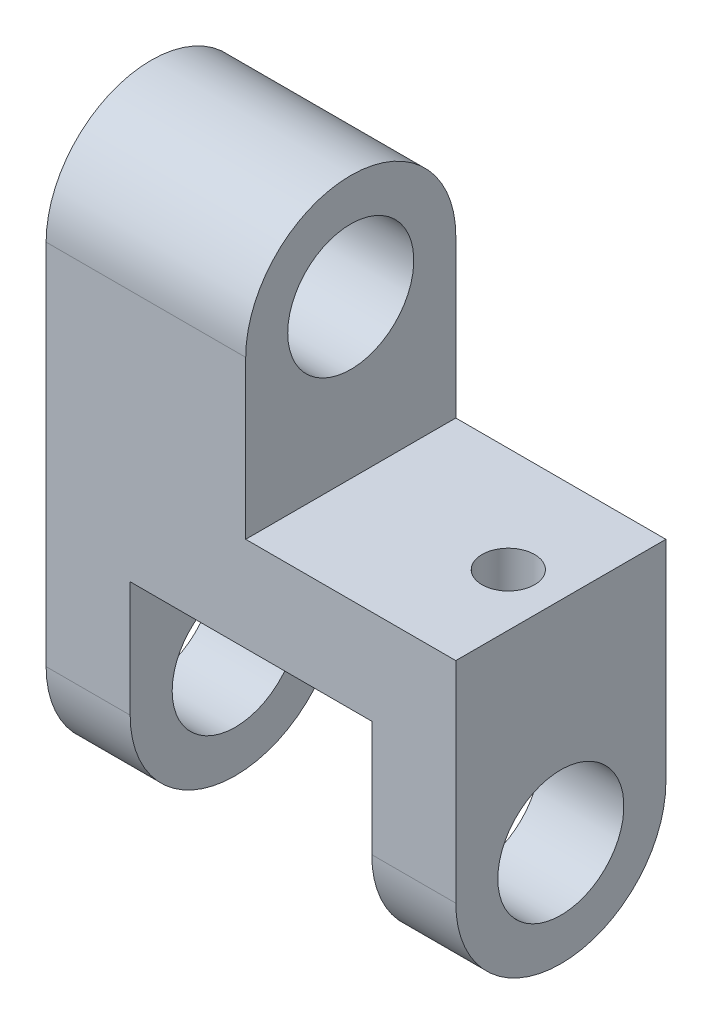
ISO-10303-21;
HEADER;
FILE_DESCRIPTION(('STEP AP214'),'2;1');
FILE_NAME('part.step','',(''),(''),'','','');
FILE_SCHEMA(('AUTOMOTIVE_DESIGN { 1 0 10303 214 1 1 1 1 }'));
ENDSEC;
DATA;
#1=APPLICATION_CONTEXT('core data for automotive mechanical design processes');
#2=APPLICATION_PROTOCOL_DEFINITION('international standard','automotive_design',2000,#1);
#3=PRODUCT_CONTEXT('',#1,'mechanical');
#4=PRODUCT('Part','Part','',(#3));
#5=PRODUCT_RELATED_PRODUCT_CATEGORY('part','',(#4));
#6=PRODUCT_DEFINITION_FORMATION('','',#4);
#7=PRODUCT_DEFINITION_CONTEXT('part definition',#1,'design');
#8=PRODUCT_DEFINITION('design','',#6,#7);
#9=PRODUCT_DEFINITION_SHAPE('','',#8);
#10=(LENGTH_UNIT() NAMED_UNIT(*) SI_UNIT(.MILLI.,.METRE.));
#11=(NAMED_UNIT(*) PLANE_ANGLE_UNIT() SI_UNIT($,.RADIAN.));
#12=(NAMED_UNIT(*) SI_UNIT($,.STERADIAN.) SOLID_ANGLE_UNIT());
#13=UNCERTAINTY_MEASURE_WITH_UNIT(LENGTH_MEASURE(1.E-05),#10,'distance_accuracy_value','');
#14=(GEOMETRIC_REPRESENTATION_CONTEXT(3) GLOBAL_UNCERTAINTY_ASSIGNED_CONTEXT((#13)) GLOBAL_UNIT_ASSIGNED_CONTEXT((#10,
#11,#12)) REPRESENTATION_CONTEXT('',''));
#15=CARTESIAN_POINT('',(0.,0.,0.));
#16=DIRECTION('',(0.,0.,1.));
#17=DIRECTION('',(1.,0.,0.));
#18=AXIS2_PLACEMENT_3D('',#15,#16,#17);
#19=CARTESIAN_POINT('',(39.,-17.5,-1.11022302462516E-13));
#20=DIRECTION('',(-1.,0.,0.));
#21=DIRECTION('',(0.,0.,1.));
#22=AXIS2_PLACEMENT_3D('',#19,#20,#21);
#23=CYLINDRICAL_SURFACE('',#22,10.);
#24=DIRECTION('',(-1.,0.,0.));
#25=VECTOR('',#24,1.);
#26=CARTESIAN_POINT('',(39.,-17.5,-10.0000000000002));
#27=LINE('',#26,#25);
#28=CARTESIAN_POINT('',(8.00000000000001,-17.4999999999999,-10.0000000000002));
#29=VERTEX_POINT('',#28);
#30=CARTESIAN_POINT('',(0.,-17.5,-10.0000000000003));
#31=VERTEX_POINT('',#30);
#32=EDGE_CURVE('E230',#29,#31,#27,.T.);
#33=ORIENTED_EDGE('',*,*,#32,.F.);
#34=CARTESIAN_POINT('',(8.00000000000001,-17.5,-1.38777878078145E-13));
#35=DIRECTION('',(-1.,0.,0.));
#36=DIRECTION('',(0.,-1.,0.));
#37=AXIS2_PLACEMENT_3D('',#34,#35,#36);
#38=CIRCLE('',#37,10.);
#39=CARTESIAN_POINT('',(8.00000000000001,-17.4999999999999,9.99999999999982));
#40=VERTEX_POINT('',#39);
#41=EDGE_CURVE('E186',#29,#40,#38,.T.);
#42=ORIENTED_EDGE('',*,*,#41,.T.);
#43=DIRECTION('',(-1.,0.,0.));
#44=VECTOR('',#43,1.);
#45=CARTESIAN_POINT('',(39.,-17.5,9.99999999999994));
#46=LINE('',#45,#44);
#47=CARTESIAN_POINT('',(0.,-17.5,9.99999999999984));
#48=VERTEX_POINT('',#47);
#49=EDGE_CURVE('E235',#40,#48,#46,.T.);
#50=ORIENTED_EDGE('',*,*,#49,.T.);
#51=CARTESIAN_POINT('',(0.,-17.5,0.));
#52=DIRECTION('',(1.,0.,0.));
#53=DIRECTION('',(0.,0.,-1.));
#54=AXIS2_PLACEMENT_3D('',#51,#52,#53);
#55=CIRCLE('',#54,10.);
#56=EDGE_CURVE('E221',#48,#31,#55,.T.);
#57=ORIENTED_EDGE('',*,*,#56,.T.);
#58=EDGE_LOOP('',(#33,#42,#50,#57));
#59=FACE_BOUND('',#58,.T.);
#60=ADVANCED_FACE('F38',(#59),#23,.T.);
#61=CARTESIAN_POINT('',(39.,-17.5,-1.11022302462516E-13));
#62=DIRECTION('',(-1.,0.,0.));
#63=DIRECTION('',(0.,0.,1.));
#64=AXIS2_PLACEMENT_3D('',#61,#62,#63);
#65=CYLINDRICAL_SURFACE('',#64,6.);
#66=CARTESIAN_POINT('',(8.00000000000001,-17.5,-1.38777878078145E-13));
#67=DIRECTION('',(-1.,0.,0.));
#68=DIRECTION('',(0.,-1.,0.));
#69=AXIS2_PLACEMENT_3D('',#66,#67,#68);
#70=CIRCLE('',#69,6.);
#71=CARTESIAN_POINT('',(8.00000000000001,-23.5,-1.38444811170757E-13));
#72=VERTEX_POINT('',#71);
#73=EDGE_CURVE('E185',#72,#72,#70,.T.);
#74=ORIENTED_EDGE('',*,*,#73,.F.);
#75=EDGE_LOOP('',(#74));
#76=FACE_BOUND('',#75,.T.);
#77=CARTESIAN_POINT('',(0.,-17.5,0.));
#78=DIRECTION('',(1.,0.,0.));
#79=DIRECTION('',(0.,0.,1.));
#80=AXIS2_PLACEMENT_3D('',#77,#78,#79);
#81=CIRCLE('',#80,6.);
#82=CARTESIAN_POINT('',(0.,-17.5,5.99999999999998));
#83=VERTEX_POINT('',#82);
#84=EDGE_CURVE('E190',#83,#83,#81,.T.);
#85=ORIENTED_EDGE('',*,*,#84,.F.);
#86=EDGE_LOOP('',(#85));
#87=FACE_BOUND('',#86,.T.);
#88=ADVANCED_FACE('F249',(#76,#87),#65,.F.);
#89=CARTESIAN_POINT('',(39.,17.5,-1.80411241501588E-13));
#90=DIRECTION('',(1.,0.,0.));
#91=DIRECTION('',(0.,0.,-1.));
#92=AXIS2_PLACEMENT_3D('',#89,#90,#91);
#93=PLANE('',#92);
#94=DIRECTION('',(0.,0.,-1.));
#95=VECTOR('',#94,1.);
#96=CARTESIAN_POINT('',(39.,2.50000000000007,0.));
#97=LINE('',#96,#95);
#98=CARTESIAN_POINT('',(39.,2.49999999999999,9.99999999999976));
#99=VERTEX_POINT('',#98);
#100=CARTESIAN_POINT('',(39.,2.50000000000009,-10.0000000000003));
#101=VERTEX_POINT('',#100);
#102=EDGE_CURVE('E56',#99,#101,#97,.T.);
#103=ORIENTED_EDGE('',*,*,#102,.F.);
#104=DIRECTION('',(0.,-1.,0.));
#105=VECTOR('',#104,1.);
#106=CARTESIAN_POINT('',(39.,17.5,9.99999999999995));
#107=LINE('',#106,#105);
#108=CARTESIAN_POINT('',(39.,-17.5,9.99999999999994));
#109=VERTEX_POINT('',#108);
#110=EDGE_CURVE('E139',#99,#109,#107,.T.);
#111=ORIENTED_EDGE('',*,*,#110,.T.);
#112=CARTESIAN_POINT('',(39.,-17.5,-1.11022302462516E-13));
#113=DIRECTION('',(1.,0.,0.));
#114=DIRECTION('',(0.,0.,-1.));
#115=AXIS2_PLACEMENT_3D('',#112,#113,#114);
#116=CIRCLE('',#115,10.);
#117=CARTESIAN_POINT('',(39.,-17.5,-10.0000000000002));
#118=VERTEX_POINT('',#117);
#119=EDGE_CURVE('E205',#109,#118,#116,.T.);
#120=ORIENTED_EDGE('',*,*,#119,.T.);
#121=DIRECTION('',(0.,1.,0.));
#122=VECTOR('',#121,1.);
#123=CARTESIAN_POINT('',(39.,17.5,-10.0000000000001));
#124=LINE('',#123,#122);
#125=EDGE_CURVE('E209',#118,#101,#124,.T.);
#126=ORIENTED_EDGE('',*,*,#125,.T.);
#127=EDGE_LOOP('',(#103,#111,#120,#126));
#128=FACE_BOUND('',#127,.T.);
#129=CARTESIAN_POINT('',(39.,-17.5,-1.11022302462516E-13));
#130=DIRECTION('',(1.,0.,0.));
#131=DIRECTION('',(0.,0.,1.));
#132=AXIS2_PLACEMENT_3D('',#129,#130,#131);
#133=CIRCLE('',#132,6.);
#134=CARTESIAN_POINT('',(39.,-17.5,5.9999999999999));
#135=VERTEX_POINT('',#134);
#136=EDGE_CURVE('E191',#135,#135,#133,.T.);
#137=ORIENTED_EDGE('',*,*,#136,.F.);
#138=EDGE_LOOP('',(#137));
#139=FACE_BOUND('',#138,.T.);
#140=ADVANCED_FACE('F252',(#128,#139),#93,.T.);
#141=CARTESIAN_POINT('',(0.,17.5,-2.08166817117217E-13));
#142=DIRECTION('',(1.,0.,0.));
#143=DIRECTION('',(0.,0.,-1.));
#144=AXIS2_PLACEMENT_3D('',#141,#142,#143);
#145=PLANE('',#144);
#146=CARTESIAN_POINT('',(0.,17.5,-2.08166817117217E-13));
#147=DIRECTION('',(1.,0.,0.));
#148=DIRECTION('',(0.,0.,-1.));
#149=AXIS2_PLACEMENT_3D('',#146,#147,#148);
#150=CIRCLE('',#149,10.);
#151=CARTESIAN_POINT('',(0.,17.5,-10.));
#152=VERTEX_POINT('',#151);
#153=CARTESIAN_POINT('',(0.,17.5,9.99999999999977));
#154=VERTEX_POINT('',#153);
#155=EDGE_CURVE('E202',#152,#154,#150,.T.);
#156=ORIENTED_EDGE('',*,*,#155,.F.);
#157=DIRECTION('',(0.,1.,0.));
#158=VECTOR('',#157,1.);
#159=CARTESIAN_POINT('',(0.,17.5,-10.));
#160=LINE('',#159,#158);
#161=EDGE_CURVE('E206',#31,#152,#160,.T.);
#162=ORIENTED_EDGE('',*,*,#161,.F.);
#163=ORIENTED_EDGE('',*,*,#56,.F.);
#164=DIRECTION('',(0.,-1.,0.));
#165=VECTOR('',#164,1.);
#166=CARTESIAN_POINT('',(0.,17.5,9.99999999999977));
#167=LINE('',#166,#165);
#168=EDGE_CURVE('E217',#154,#48,#167,.T.);
#169=ORIENTED_EDGE('',*,*,#168,.F.);
#170=EDGE_LOOP('',(#156,#162,#163,#169));
#171=FACE_BOUND('',#170,.T.);
#172=CARTESIAN_POINT('',(0.,17.5,-2.08166817117217E-13));
#173=DIRECTION('',(1.,0.,0.));
#174=DIRECTION('',(0.,0.,-1.));
#175=AXIS2_PLACEMENT_3D('',#172,#173,#174);
#176=CIRCLE('',#175,6.);
#177=CARTESIAN_POINT('',(0.,17.5,-6.00000000000022));
#178=VERTEX_POINT('',#177);
#179=EDGE_CURVE('E195',#178,#178,#176,.T.);
#180=ORIENTED_EDGE('',*,*,#179,.T.);
#181=EDGE_LOOP('',(#180));
#182=FACE_BOUND('',#181,.T.);
#183=ORIENTED_EDGE('',*,*,#84,.T.);
#184=EDGE_LOOP('',(#183));
#185=FACE_BOUND('',#184,.T.);
#186=ADVANCED_FACE('F257',(#171,#182,#185),#145,.F.);
#187=CARTESIAN_POINT('',(39.,17.5,-1.80411241501588E-13));
#188=DIRECTION('',(-1.,0.,0.));
#189=DIRECTION('',(0.,0.,1.));
#190=AXIS2_PLACEMENT_3D('',#187,#188,#189);
#191=CYLINDRICAL_SURFACE('',#190,10.);
#192=DIRECTION('',(-1.,0.,0.));
#193=VECTOR('',#192,1.);
#194=CARTESIAN_POINT('',(39.,17.5,9.99999999999995));
#195=LINE('',#194,#193);
#196=CARTESIAN_POINT('',(19.,17.5000000000001,9.99999999999995));
#197=VERTEX_POINT('',#196);
#198=EDGE_CURVE('E11',#197,#154,#195,.T.);
#199=ORIENTED_EDGE('',*,*,#198,.F.);
#200=CARTESIAN_POINT('',(19.,17.5,-2.22044604925031E-13));
#201=DIRECTION('',(-1.,0.,0.));
#202=DIRECTION('',(0.,0.,1.));
#203=AXIS2_PLACEMENT_3D('',#200,#201,#202);
#204=CIRCLE('',#203,10.);
#205=CARTESIAN_POINT('',(19.,17.5,-10.0000000000001));
#206=VERTEX_POINT('',#205);
#207=EDGE_CURVE('E123',#197,#206,#204,.T.);
#208=ORIENTED_EDGE('',*,*,#207,.T.);
#209=DIRECTION('',(-1.,0.,0.));
#210=VECTOR('',#209,1.);
#211=CARTESIAN_POINT('',(39.,17.5,-10.0000000000001));
#212=LINE('',#211,#210);
#213=EDGE_CURVE('E213',#206,#152,#212,.T.);
#214=ORIENTED_EDGE('',*,*,#213,.T.);
#215=ORIENTED_EDGE('',*,*,#155,.T.);
#216=EDGE_LOOP('',(#199,#208,#214,#215));
#217=FACE_BOUND('',#216,.T.);
#218=ADVANCED_FACE('F40',(#217),#191,.T.);
#219=CARTESIAN_POINT('',(39.,17.5,9.99999999999995));
#220=DIRECTION('',(0.,0.,-1.));
#221=DIRECTION('',(-1.,0.,0.));
#222=AXIS2_PLACEMENT_3D('',#219,#220,#221);
#223=PLANE('',#222);
#224=DIRECTION('',(1.,0.,0.));
#225=VECTOR('',#224,1.);
#226=CARTESIAN_POINT('',(19.,2.50000000000004,9.99999999999976));
#227=LINE('',#226,#225);
#228=CARTESIAN_POINT('',(19.,2.50000000000004,9.99999999999976));
#229=VERTEX_POINT('',#228);
#230=EDGE_CURVE('E128',#229,#99,#227,.T.);
#231=ORIENTED_EDGE('',*,*,#230,.F.);
#232=DIRECTION('',(0.,-1.,0.));
#233=VECTOR('',#232,1.);
#234=CARTESIAN_POINT('',(19.,35.0972759164167,9.99999999999997));
#235=LINE('',#234,#233);
#236=EDGE_CURVE('E118',#197,#229,#235,.T.);
#237=ORIENTED_EDGE('',*,*,#236,.F.);
#238=ORIENTED_EDGE('',*,*,#198,.T.);
#239=ORIENTED_EDGE('',*,*,#168,.T.);
#240=ORIENTED_EDGE('',*,*,#49,.F.);
#241=DIRECTION('',(0.,-1.,0.));
#242=VECTOR('',#241,1.);
#243=CARTESIAN_POINT('',(8.00000000000001,-6.49999999999999,9.99999999999995));
#244=LINE('',#243,#242);
#245=CARTESIAN_POINT('',(8.00000000000001,-6.49999999999999,9.99999999999995));
#246=VERTEX_POINT('',#245);
#247=EDGE_CURVE('E154',#246,#40,#244,.T.);
#248=ORIENTED_EDGE('',*,*,#247,.F.);
#249=DIRECTION('',(-1.,0.,0.));
#250=VECTOR('',#249,1.);
#251=CARTESIAN_POINT('',(8.00000000000001,-6.49999999999999,9.99999999999995));
#252=LINE('',#251,#250);
#253=CARTESIAN_POINT('',(31.,-6.50000000000002,10.));
#254=VERTEX_POINT('',#253);
#255=EDGE_CURVE('E160',#254,#246,#252,.T.);
#256=ORIENTED_EDGE('',*,*,#255,.F.);
#257=DIRECTION('',(0.,1.,0.));
#258=VECTOR('',#257,1.);
#259=CARTESIAN_POINT('',(31.,-6.50000000000002,10.));
#260=LINE('',#259,#258);
#261=CARTESIAN_POINT('',(31.,-17.5,9.99999999999994));
#262=VERTEX_POINT('',#261);
#263=EDGE_CURVE('E157',#262,#254,#260,.T.);
#264=ORIENTED_EDGE('',*,*,#263,.F.);
#265=EDGE_CURVE('E48',#109,#262,#46,.T.);
#266=ORIENTED_EDGE('',*,*,#265,.F.);
#267=ORIENTED_EDGE('',*,*,#110,.F.);
#268=EDGE_LOOP('',(#231,#237,#238,#239,#240,#248,#256,#264,#266,#267));
#269=FACE_BOUND('',#268,.T.);
#270=ADVANCED_FACE('F137',(#269),#223,.F.);
#271=ORIENTED_EDGE('',*,*,#265,.T.);
#272=CARTESIAN_POINT('',(31.,-17.5,-2.4980018054066E-13));
#273=DIRECTION('',(1.,0.,0.));
#274=DIRECTION('',(0.,1.,0.));
#275=AXIS2_PLACEMENT_3D('',#272,#273,#274);
#276=CIRCLE('',#275,10.);
#277=CARTESIAN_POINT('',(31.,-17.5000000000001,-10.0000000000003));
#278=VERTEX_POINT('',#277);
#279=EDGE_CURVE('E181',#262,#278,#276,.T.);
#280=ORIENTED_EDGE('',*,*,#279,.T.);
#281=EDGE_CURVE('E231',#118,#278,#27,.T.);
#282=ORIENTED_EDGE('',*,*,#281,.F.);
#283=ORIENTED_EDGE('',*,*,#119,.F.);
#284=EDGE_LOOP('',(#271,#280,#282,#283));
#285=FACE_BOUND('',#284,.T.);
#286=ADVANCED_FACE('F274',(#285),#23,.T.);
#287=CARTESIAN_POINT('',(39.,17.5,-10.0000000000001));
#288=DIRECTION('',(0.,0.,1.));
#289=DIRECTION('',(1.,0.,0.));
#290=AXIS2_PLACEMENT_3D('',#287,#288,#289);
#291=PLANE('',#290);
#292=ORIENTED_EDGE('',*,*,#213,.F.);
#293=DIRECTION('',(0.,-1.,0.));
#294=VECTOR('',#293,1.);
#295=CARTESIAN_POINT('',(19.,35.0972759164167,-10.0000000000001));
#296=LINE('',#295,#294);
#297=CARTESIAN_POINT('',(19.,2.50000000000007,-10.0000000000001));
#298=VERTEX_POINT('',#297);
#299=EDGE_CURVE('E141',#206,#298,#296,.T.);
#300=ORIENTED_EDGE('',*,*,#299,.T.);
#301=DIRECTION('',(1.,0.,0.));
#302=VECTOR('',#301,1.);
#303=CARTESIAN_POINT('',(19.,2.50000000000007,-10.0000000000001));
#304=LINE('',#303,#302);
#305=EDGE_CURVE('E132',#298,#101,#304,.T.);
#306=ORIENTED_EDGE('',*,*,#305,.T.);
#307=ORIENTED_EDGE('',*,*,#125,.F.);
#308=ORIENTED_EDGE('',*,*,#281,.T.);
#309=DIRECTION('',(0.,1.,0.));
#310=VECTOR('',#309,1.);
#311=CARTESIAN_POINT('',(31.,-6.49999999999996,-10.));
#312=LINE('',#311,#310);
#313=CARTESIAN_POINT('',(31.,-6.49999999999996,-10.));
#314=VERTEX_POINT('',#313);
#315=EDGE_CURVE('E168',#278,#314,#312,.T.);
#316=ORIENTED_EDGE('',*,*,#315,.T.);
#317=DIRECTION('',(-1.,0.,0.));
#318=VECTOR('',#317,1.);
#319=CARTESIAN_POINT('',(8.00000000000001,-6.49999999999995,-10.0000000000001));
#320=LINE('',#319,#318);
#321=CARTESIAN_POINT('',(8.00000000000001,-6.49999999999995,-10.0000000000001));
#322=VERTEX_POINT('',#321);
#323=EDGE_CURVE('E64',#314,#322,#320,.T.);
#324=ORIENTED_EDGE('',*,*,#323,.T.);
#325=DIRECTION('',(0.,-1.,0.));
#326=VECTOR('',#325,1.);
#327=CARTESIAN_POINT('',(8.00000000000001,-6.49999999999995,-10.0000000000001));
#328=LINE('',#327,#326);
#329=EDGE_CURVE('E164',#322,#29,#328,.T.);
#330=ORIENTED_EDGE('',*,*,#329,.T.);
#331=ORIENTED_EDGE('',*,*,#32,.T.);
#332=ORIENTED_EDGE('',*,*,#161,.T.);
#333=EDGE_LOOP('',(#292,#300,#306,#307,#308,#316,#324,#330,#331,#332));
#334=FACE_BOUND('',#333,.T.);
#335=ADVANCED_FACE('F279',(#334),#291,.F.);
#336=CARTESIAN_POINT('',(39.,17.5,-1.80411241501588E-13));
#337=DIRECTION('',(-1.,0.,0.));
#338=DIRECTION('',(0.,0.,1.));
#339=AXIS2_PLACEMENT_3D('',#336,#337,#338);
#340=CYLINDRICAL_SURFACE('',#339,6.);
#341=CARTESIAN_POINT('',(19.,17.5,-2.22044604925031E-13));
#342=DIRECTION('',(-1.,0.,0.));
#343=DIRECTION('',(0.,0.,1.));
#344=AXIS2_PLACEMENT_3D('',#341,#342,#343);
#345=CIRCLE('',#344,6.);
#346=CARTESIAN_POINT('',(19.,17.5,5.99999999999979));
#347=VERTEX_POINT('',#346);
#348=EDGE_CURVE('E42',#347,#347,#345,.T.);
#349=ORIENTED_EDGE('',*,*,#348,.F.);
#350=EDGE_LOOP('',(#349));
#351=FACE_BOUND('',#350,.T.);
#352=ORIENTED_EDGE('',*,*,#179,.F.);
#353=EDGE_LOOP('',(#352));
#354=FACE_BOUND('',#353,.T.);
#355=ADVANCED_FACE('F285',(#351,#354),#340,.F.);
#356=CARTESIAN_POINT('',(31.,-17.5,-2.4980018054066E-13));
#357=DIRECTION('',(1.,0.,0.));
#358=DIRECTION('',(0.,1.,0.));
#359=AXIS2_PLACEMENT_3D('',#356,#357,#358);
#360=CIRCLE('',#359,6.);
#361=CARTESIAN_POINT('',(31.,-11.5,-2.50133247448048E-13));
#362=VERTEX_POINT('',#361);
#363=EDGE_CURVE('E178',#362,#362,#360,.T.);
#364=ORIENTED_EDGE('',*,*,#363,.F.);
#365=EDGE_LOOP('',(#364));
#366=FACE_BOUND('',#365,.T.);
#367=ORIENTED_EDGE('',*,*,#136,.T.);
#368=EDGE_LOOP('',(#367));
#369=FACE_BOUND('',#368,.T.);
#370=ADVANCED_FACE('F254',(#366,#369),#65,.F.);
#371=CARTESIAN_POINT('',(8.00000000000001,-6.49999999999995,-10.0000000000001));
#372=DIRECTION('',(-1.,0.,0.));
#373=DIRECTION('',(0.,-1.,0.));
#374=AXIS2_PLACEMENT_3D('',#371,#372,#373);
#375=PLANE('',#374);
#376=ORIENTED_EDGE('',*,*,#73,.T.);
#377=EDGE_LOOP('',(#376));
#378=FACE_BOUND('',#377,.T.);
#379=ORIENTED_EDGE('',*,*,#329,.F.);
#380=DIRECTION('',(0.,0.,1.));
#381=VECTOR('',#380,1.);
#382=CARTESIAN_POINT('',(8.00000000000001,-6.49999999999995,-10.0000000000001));
#383=LINE('',#382,#381);
#384=EDGE_CURVE('E175',#322,#246,#383,.T.);
#385=ORIENTED_EDGE('',*,*,#384,.T.);
#386=ORIENTED_EDGE('',*,*,#247,.T.);
#387=ORIENTED_EDGE('',*,*,#41,.F.);
#388=EDGE_LOOP('',(#379,#385,#386,#387));
#389=FACE_BOUND('',#388,.T.);
#390=ADVANCED_FACE('F246',(#378,#389),#375,.F.);
#391=CARTESIAN_POINT('',(31.,-6.49999999999996,-10.));
#392=DIRECTION('',(1.,0.,0.));
#393=DIRECTION('',(0.,1.,0.));
#394=AXIS2_PLACEMENT_3D('',#391,#392,#393);
#395=PLANE('',#394);
#396=ORIENTED_EDGE('',*,*,#363,.T.);
#397=EDGE_LOOP('',(#396));
#398=FACE_BOUND('',#397,.T.);
#399=ORIENTED_EDGE('',*,*,#263,.T.);
#400=DIRECTION('',(0.,0.,1.));
#401=VECTOR('',#400,1.);
#402=CARTESIAN_POINT('',(31.,-6.49999999999996,-10.));
#403=LINE('',#402,#401);
#404=EDGE_CURVE('E174',#314,#254,#403,.T.);
#405=ORIENTED_EDGE('',*,*,#404,.F.);
#406=ORIENTED_EDGE('',*,*,#315,.F.);
#407=ORIENTED_EDGE('',*,*,#279,.F.);
#408=EDGE_LOOP('',(#399,#405,#406,#407));
#409=FACE_BOUND('',#408,.T.);
#410=ADVANCED_FACE('F293',(#398,#409),#395,.F.);
#411=CARTESIAN_POINT('',(8.00000000000001,-6.49999999999995,-10.0000000000001));
#412=DIRECTION('',(0.,1.,0.));
#413=DIRECTION('',(0.,0.,1.));
#414=AXIS2_PLACEMENT_3D('',#411,#412,#413);
#415=PLANE('',#414);
#416=ORIENTED_EDGE('',*,*,#384,.F.);
#417=ORIENTED_EDGE('',*,*,#323,.F.);
#418=ORIENTED_EDGE('',*,*,#404,.T.);
#419=ORIENTED_EDGE('',*,*,#255,.T.);
#420=EDGE_LOOP('',(#416,#417,#418,#419));
#421=FACE_BOUND('',#420,.T.);
#422=ADVANCED_FACE('F294',(#421),#415,.F.);
#423=CARTESIAN_POINT('',(19.,35.0972759164167,-10.0000000000001));
#424=DIRECTION('',(-1.,0.,0.));
#425=DIRECTION('',(0.,0.,1.));
#426=AXIS2_PLACEMENT_3D('',#423,#424,#425);
#427=PLANE('',#426);
#428=ORIENTED_EDGE('',*,*,#348,.T.);
#429=EDGE_LOOP('',(#428));
#430=FACE_BOUND('',#429,.T.);
#431=ORIENTED_EDGE('',*,*,#236,.T.);
#432=DIRECTION('',(0.,0.,1.));
#433=VECTOR('',#432,1.);
#434=CARTESIAN_POINT('',(19.,2.50000000000007,-10.0000000000001));
#435=LINE('',#434,#433);
#436=EDGE_CURVE('E121',#298,#229,#435,.T.);
#437=ORIENTED_EDGE('',*,*,#436,.F.);
#438=ORIENTED_EDGE('',*,*,#299,.F.);
#439=ORIENTED_EDGE('',*,*,#207,.F.);
#440=EDGE_LOOP('',(#431,#437,#438,#439));
#441=FACE_BOUND('',#440,.T.);
#442=ADVANCED_FACE('F120',(#430,#441),#427,.F.);
#443=CARTESIAN_POINT('',(19.,2.50000000000007,-10.0000000000001));
#444=DIRECTION('',(0.,-1.,0.));
#445=DIRECTION('',(0.,0.,-1.));
#446=AXIS2_PLACEMENT_3D('',#443,#444,#445);
#447=PLANE('',#446);
#448=CARTESIAN_POINT('',(34.,2.50000000000006,0.));
#449=DIRECTION('',(0.,1.,0.));
#450=DIRECTION('',(0.,0.,1.));
#451=AXIS2_PLACEMENT_3D('',#448,#449,#450);
#452=CIRCLE('',#451,2.5);
#453=CARTESIAN_POINT('',(34.,2.50000000000006,2.50000000000003));
#454=VERTEX_POINT('',#453);
#455=EDGE_CURVE('E357',#454,#454,#452,.T.);
#456=ORIENTED_EDGE('',*,*,#455,.F.);
#457=EDGE_LOOP('',(#456));
#458=FACE_BOUND('',#457,.T.);
#459=ORIENTED_EDGE('',*,*,#102,.T.);
#460=ORIENTED_EDGE('',*,*,#305,.F.);
#461=ORIENTED_EDGE('',*,*,#436,.T.);
#462=ORIENTED_EDGE('',*,*,#230,.T.);
#463=EDGE_LOOP('',(#459,#460,#461,#462));
#464=FACE_BOUND('',#463,.T.);
#465=ADVANCED_FACE('F131',(#458,#464),#447,.F.);
#466=CARTESIAN_POINT('',(34.,-9.49999999999997,0.));
#467=DIRECTION('',(0.,1.,0.));
#468=DIRECTION('',(0.,0.,1.));
#469=AXIS2_PLACEMENT_3D('',#466,#467,#468);
#470=CYLINDRICAL_SURFACE('',#469,2.5);
#471=CARTESIAN_POINT('',(34.,-9.49999999999997,0.));
#472=DIRECTION('',(0.,1.,0.));
#473=DIRECTION('',(0.,0.,1.));
#474=AXIS2_PLACEMENT_3D('',#471,#472,#473);
#475=CIRCLE('',#474,2.5);
#476=CARTESIAN_POINT('',(34.,-9.49999999999997,2.49999999999992));
#477=VERTEX_POINT('',#476);
#478=EDGE_CURVE('E129',#477,#477,#475,.T.);
#479=ORIENTED_EDGE('',*,*,#478,.F.);
#480=EDGE_LOOP('',(#479));
#481=FACE_BOUND('',#480,.T.);
#482=ORIENTED_EDGE('',*,*,#455,.T.);
#483=EDGE_LOOP('',(#482));
#484=FACE_BOUND('',#483,.T.);
#485=ADVANCED_FACE('F344',(#481,#484),#470,.F.);
#486=CARTESIAN_POINT('',(34.,-9.49999999999997,0.));
#487=DIRECTION('',(0.,1.,0.));
#488=DIRECTION('',(0.,0.,1.));
#489=AXIS2_PLACEMENT_3D('',#486,#487,#488);
#490=PLANE('',#489);
#491=ORIENTED_EDGE('',*,*,#478,.T.);
#492=EDGE_LOOP('',(#491));
#493=FACE_BOUND('',#492,.T.);
#494=ADVANCED_FACE('F348',(#493),#490,.T.);
#495=CLOSED_SHELL('',(#60,#88,#140,#186,#218,#270,#286,#335,#355,#370,#390,#410,#422,#442,#465,
#485,#494));
#496=MANIFOLD_SOLID_BREP('B2',#495);
#497=ADVANCED_BREP_SHAPE_REPRESENTATION('',(#18,#496),#14);
#498=SHAPE_DEFINITION_REPRESENTATION(#9,#497);
ENDSEC;
END-ISO-10303-21;
